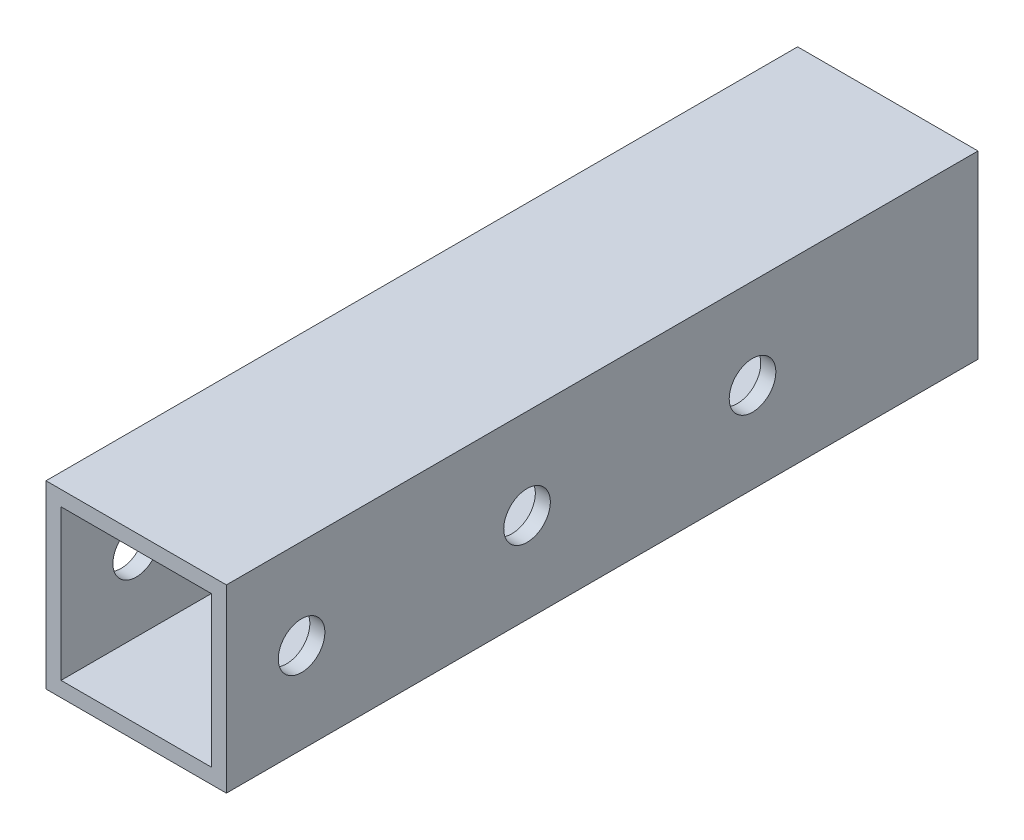
ISO-10303-21;
HEADER;
FILE_DESCRIPTION(('STEP AP214'),'2;1');
FILE_NAME('part.step','',(''),(''),'','','');
FILE_SCHEMA(('AUTOMOTIVE_DESIGN { 1 0 10303 214 1 1 1 1 }'));
ENDSEC;
DATA;
#1=APPLICATION_CONTEXT('core data for automotive mechanical design processes');
#2=APPLICATION_PROTOCOL_DEFINITION('international standard','automotive_design',2000,#1);
#3=PRODUCT_CONTEXT('',#1,'mechanical');
#4=PRODUCT('Part','Part','',(#3));
#5=PRODUCT_RELATED_PRODUCT_CATEGORY('part','',(#4));
#6=PRODUCT_DEFINITION_FORMATION('','',#4);
#7=PRODUCT_DEFINITION_CONTEXT('part definition',#1,'design');
#8=PRODUCT_DEFINITION('design','',#6,#7);
#9=PRODUCT_DEFINITION_SHAPE('','',#8);
#10=(LENGTH_UNIT() NAMED_UNIT(*) SI_UNIT(.MILLI.,.METRE.));
#11=(NAMED_UNIT(*) PLANE_ANGLE_UNIT() SI_UNIT($,.RADIAN.));
#12=(NAMED_UNIT(*) SI_UNIT($,.STERADIAN.) SOLID_ANGLE_UNIT());
#13=UNCERTAINTY_MEASURE_WITH_UNIT(LENGTH_MEASURE(1.E-05),#10,'distance_accuracy_value','');
#14=(GEOMETRIC_REPRESENTATION_CONTEXT(3) GLOBAL_UNCERTAINTY_ASSIGNED_CONTEXT((#13)) GLOBAL_UNIT_ASSIGNED_CONTEXT((#10,
#11,#12)) REPRESENTATION_CONTEXT('',''));
#15=CARTESIAN_POINT('',(0.,0.,0.));
#16=DIRECTION('',(0.,0.,1.));
#17=DIRECTION('',(1.,0.,0.));
#18=AXIS2_PLACEMENT_3D('',#15,#16,#17);
#19=CARTESIAN_POINT('',(0.,0.,50.));
#20=DIRECTION('',(0.,0.,-1.));
#21=DIRECTION('',(-1.,0.,0.));
#22=AXIS2_PLACEMENT_3D('',#19,#20,#21);
#23=PLANE('',#22);
#24=DIRECTION('',(0.,-1.,0.));
#25=VECTOR('',#24,1.);
#26=CARTESIAN_POINT('',(0.,0.,50.));
#27=LINE('',#26,#25);
#28=CARTESIAN_POINT('',(0.,12.,50.));
#29=VERTEX_POINT('',#28);
#30=CARTESIAN_POINT('',(0.,0.,50.));
#31=VERTEX_POINT('',#30);
#32=EDGE_CURVE('E146',#29,#31,#27,.T.);
#33=ORIENTED_EDGE('',*,*,#32,.T.);
#34=DIRECTION('',(1.,0.,0.));
#35=VECTOR('',#34,1.);
#36=CARTESIAN_POINT('',(0.,0.,50.));
#37=LINE('',#36,#35);
#38=CARTESIAN_POINT('',(12.,0.,50.));
#39=VERTEX_POINT('',#38);
#40=EDGE_CURVE('E149',#31,#39,#37,.T.);
#41=ORIENTED_EDGE('',*,*,#40,.T.);
#42=DIRECTION('',(0.,1.,0.));
#43=VECTOR('',#42,1.);
#44=CARTESIAN_POINT('',(12.,0.,50.));
#45=LINE('',#44,#43);
#46=CARTESIAN_POINT('',(12.,12.,50.));
#47=VERTEX_POINT('',#46);
#48=EDGE_CURVE('E152',#39,#47,#45,.T.);
#49=ORIENTED_EDGE('',*,*,#48,.T.);
#50=DIRECTION('',(-1.,0.,0.));
#51=VECTOR('',#50,1.);
#52=CARTESIAN_POINT('',(0.,12.,50.));
#53=LINE('',#52,#51);
#54=EDGE_CURVE('E154',#47,#29,#53,.T.);
#55=ORIENTED_EDGE('',*,*,#54,.T.);
#56=EDGE_LOOP('',(#33,#41,#49,#55));
#57=FACE_BOUND('',#56,.T.);
#58=DIRECTION('',(1.,0.,0.));
#59=VECTOR('',#58,1.);
#60=CARTESIAN_POINT('',(1.,1.,50.));
#61=LINE('',#60,#59);
#62=CARTESIAN_POINT('',(1.,1.,50.));
#63=VERTEX_POINT('',#62);
#64=CARTESIAN_POINT('',(11.,1.,50.));
#65=VERTEX_POINT('',#64);
#66=EDGE_CURVE('E108',#63,#65,#61,.T.);
#67=ORIENTED_EDGE('',*,*,#66,.F.);
#68=DIRECTION('',(0.,-1.,0.));
#69=VECTOR('',#68,1.);
#70=CARTESIAN_POINT('',(1.,1.,50.));
#71=LINE('',#70,#69);
#72=CARTESIAN_POINT('',(1.,11.,50.));
#73=VERTEX_POINT('',#72);
#74=EDGE_CURVE('E130',#73,#63,#71,.T.);
#75=ORIENTED_EDGE('',*,*,#74,.F.);
#76=DIRECTION('',(-1.,0.,0.));
#77=VECTOR('',#76,1.);
#78=CARTESIAN_POINT('',(1.,11.,50.));
#79=LINE('',#78,#77);
#80=CARTESIAN_POINT('',(11.,11.,50.));
#81=VERTEX_POINT('',#80);
#82=EDGE_CURVE('E128',#81,#73,#79,.T.);
#83=ORIENTED_EDGE('',*,*,#82,.F.);
#84=DIRECTION('',(0.,1.,0.));
#85=VECTOR('',#84,1.);
#86=CARTESIAN_POINT('',(11.,1.,50.));
#87=LINE('',#86,#85);
#88=EDGE_CURVE('E116',#65,#81,#87,.T.);
#89=ORIENTED_EDGE('',*,*,#88,.F.);
#90=EDGE_LOOP('',(#67,#75,#83,#89));
#91=FACE_BOUND('',#90,.T.);
#92=ADVANCED_FACE('F41',(#57,#91),#23,.F.);
#93=CARTESIAN_POINT('',(0.,0.,0.));
#94=DIRECTION('',(0.,0.,-1.));
#95=DIRECTION('',(-1.,0.,0.));
#96=AXIS2_PLACEMENT_3D('',#93,#94,#95);
#97=PLANE('',#96);
#98=DIRECTION('',(0.,-1.,0.));
#99=VECTOR('',#98,1.);
#100=CARTESIAN_POINT('',(0.,0.,0.));
#101=LINE('',#100,#99);
#102=CARTESIAN_POINT('',(0.,12.,0.));
#103=VERTEX_POINT('',#102);
#104=CARTESIAN_POINT('',(0.,0.,0.));
#105=VERTEX_POINT('',#104);
#106=EDGE_CURVE('E124',#103,#105,#101,.T.);
#107=ORIENTED_EDGE('',*,*,#106,.F.);
#108=DIRECTION('',(-1.,0.,0.));
#109=VECTOR('',#108,1.);
#110=CARTESIAN_POINT('',(0.,12.,0.));
#111=LINE('',#110,#109);
#112=CARTESIAN_POINT('',(12.,12.,0.));
#113=VERTEX_POINT('',#112);
#114=EDGE_CURVE('E150',#113,#103,#111,.T.);
#115=ORIENTED_EDGE('',*,*,#114,.F.);
#116=DIRECTION('',(0.,1.,0.));
#117=VECTOR('',#116,1.);
#118=CARTESIAN_POINT('',(12.,0.,0.));
#119=LINE('',#118,#117);
#120=CARTESIAN_POINT('',(12.,0.,0.));
#121=VERTEX_POINT('',#120);
#122=EDGE_CURVE('E161',#121,#113,#119,.T.);
#123=ORIENTED_EDGE('',*,*,#122,.F.);
#124=DIRECTION('',(1.,0.,0.));
#125=VECTOR('',#124,1.);
#126=CARTESIAN_POINT('',(0.,0.,0.));
#127=LINE('',#126,#125);
#128=EDGE_CURVE('E159',#105,#121,#127,.T.);
#129=ORIENTED_EDGE('',*,*,#128,.F.);
#130=EDGE_LOOP('',(#107,#115,#123,#129));
#131=FACE_BOUND('',#130,.T.);
#132=DIRECTION('',(0.,-1.,0.));
#133=VECTOR('',#132,1.);
#134=CARTESIAN_POINT('',(1.,1.,0.));
#135=LINE('',#134,#133);
#136=CARTESIAN_POINT('',(1.,11.,0.));
#137=VERTEX_POINT('',#136);
#138=CARTESIAN_POINT('',(1.,1.,0.));
#139=VERTEX_POINT('',#138);
#140=EDGE_CURVE('E117',#137,#139,#135,.T.);
#141=ORIENTED_EDGE('',*,*,#140,.T.);
#142=DIRECTION('',(1.,0.,0.));
#143=VECTOR('',#142,1.);
#144=CARTESIAN_POINT('',(1.,1.,0.));
#145=LINE('',#144,#143);
#146=CARTESIAN_POINT('',(11.,1.,0.));
#147=VERTEX_POINT('',#146);
#148=EDGE_CURVE('E66',#139,#147,#145,.T.);
#149=ORIENTED_EDGE('',*,*,#148,.T.);
#150=DIRECTION('',(0.,1.,0.));
#151=VECTOR('',#150,1.);
#152=CARTESIAN_POINT('',(11.,1.,0.));
#153=LINE('',#152,#151);
#154=CARTESIAN_POINT('',(11.,11.,0.));
#155=VERTEX_POINT('',#154);
#156=EDGE_CURVE('E123',#147,#155,#153,.T.);
#157=ORIENTED_EDGE('',*,*,#156,.T.);
#158=DIRECTION('',(-1.,0.,0.));
#159=VECTOR('',#158,1.);
#160=CARTESIAN_POINT('',(1.,11.,0.));
#161=LINE('',#160,#159);
#162=EDGE_CURVE('E138',#155,#137,#161,.T.);
#163=ORIENTED_EDGE('',*,*,#162,.T.);
#164=EDGE_LOOP('',(#141,#149,#157,#163));
#165=FACE_BOUND('',#164,.T.);
#166=ADVANCED_FACE('F208',(#131,#165),#97,.T.);
#167=CARTESIAN_POINT('',(0.,0.,50.));
#168=DIRECTION('',(1.,0.,0.));
#169=DIRECTION('',(0.,0.,-1.));
#170=AXIS2_PLACEMENT_3D('',#167,#168,#169);
#171=PLANE('',#170);
#172=CARTESIAN_POINT('',(0.,6.,15.));
#173=DIRECTION('',(-1.,0.,0.));
#174=DIRECTION('',(0.,0.,1.));
#175=AXIS2_PLACEMENT_3D('',#172,#173,#174);
#176=CIRCLE('',#175,1.55);
#177=CARTESIAN_POINT('',(0.,6.,16.55));
#178=VERTEX_POINT('',#177);
#179=EDGE_CURVE('E259',#178,#178,#176,.T.);
#180=ORIENTED_EDGE('',*,*,#179,.F.);
#181=EDGE_LOOP('',(#180));
#182=FACE_BOUND('',#181,.T.);
#183=CARTESIAN_POINT('',(0.,6.,30.));
#184=DIRECTION('',(-1.,0.,0.));
#185=DIRECTION('',(0.,0.,1.));
#186=AXIS2_PLACEMENT_3D('',#183,#184,#185);
#187=CIRCLE('',#186,1.55);
#188=CARTESIAN_POINT('',(0.,6.,31.55));
#189=VERTEX_POINT('',#188);
#190=EDGE_CURVE('E263',#189,#189,#187,.T.);
#191=ORIENTED_EDGE('',*,*,#190,.F.);
#192=EDGE_LOOP('',(#191));
#193=FACE_BOUND('',#192,.T.);
#194=CARTESIAN_POINT('',(0.,6.,45.));
#195=DIRECTION('',(-1.,0.,0.));
#196=DIRECTION('',(0.,0.,1.));
#197=AXIS2_PLACEMENT_3D('',#194,#195,#196);
#198=CIRCLE('',#197,1.55);
#199=CARTESIAN_POINT('',(0.,6.,46.55));
#200=VERTEX_POINT('',#199);
#201=EDGE_CURVE('E266',#200,#200,#198,.T.);
#202=ORIENTED_EDGE('',*,*,#201,.F.);
#203=EDGE_LOOP('',(#202));
#204=FACE_BOUND('',#203,.T.);
#205=ORIENTED_EDGE('',*,*,#106,.T.);
#206=DIRECTION('',(0.,0.,-1.));
#207=VECTOR('',#206,1.);
#208=CARTESIAN_POINT('',(0.,0.,50.));
#209=LINE('',#208,#207);
#210=EDGE_CURVE('E11',#31,#105,#209,.T.);
#211=ORIENTED_EDGE('',*,*,#210,.F.);
#212=ORIENTED_EDGE('',*,*,#32,.F.);
#213=DIRECTION('',(0.,0.,-1.));
#214=VECTOR('',#213,1.);
#215=CARTESIAN_POINT('',(0.,12.,50.));
#216=LINE('',#215,#214);
#217=EDGE_CURVE('E156',#29,#103,#216,.T.);
#218=ORIENTED_EDGE('',*,*,#217,.T.);
#219=EDGE_LOOP('',(#205,#211,#212,#218));
#220=FACE_BOUND('',#219,.T.);
#221=ADVANCED_FACE('F43',(#182,#193,#204,#220),#171,.F.);
#222=CARTESIAN_POINT('',(0.,0.,50.));
#223=DIRECTION('',(0.,1.,0.));
#224=DIRECTION('',(0.,0.,1.));
#225=AXIS2_PLACEMENT_3D('',#222,#223,#224);
#226=PLANE('',#225);
#227=ORIENTED_EDGE('',*,*,#128,.T.);
#228=DIRECTION('',(0.,0.,-1.));
#229=VECTOR('',#228,1.);
#230=CARTESIAN_POINT('',(12.,0.,50.));
#231=LINE('',#230,#229);
#232=EDGE_CURVE('E50',#39,#121,#231,.T.);
#233=ORIENTED_EDGE('',*,*,#232,.F.);
#234=ORIENTED_EDGE('',*,*,#40,.F.);
#235=ORIENTED_EDGE('',*,*,#210,.T.);
#236=EDGE_LOOP('',(#227,#233,#234,#235));
#237=FACE_BOUND('',#236,.T.);
#238=ADVANCED_FACE('F235',(#237),#226,.F.);
#239=CARTESIAN_POINT('',(12.,0.,50.));
#240=DIRECTION('',(-1.,0.,0.));
#241=DIRECTION('',(0.,0.,1.));
#242=AXIS2_PLACEMENT_3D('',#239,#240,#241);
#243=PLANE('',#242);
#244=CARTESIAN_POINT('',(12.,6.,15.));
#245=DIRECTION('',(-1.,0.,0.));
#246=DIRECTION('',(0.,0.,1.));
#247=AXIS2_PLACEMENT_3D('',#244,#245,#246);
#248=CIRCLE('',#247,1.55);
#249=CARTESIAN_POINT('',(12.,6.,16.55));
#250=VERTEX_POINT('',#249);
#251=EDGE_CURVE('E174',#250,#250,#248,.T.);
#252=ORIENTED_EDGE('',*,*,#251,.T.);
#253=EDGE_LOOP('',(#252));
#254=FACE_BOUND('',#253,.T.);
#255=CARTESIAN_POINT('',(12.,6.,30.));
#256=DIRECTION('',(-1.,0.,0.));
#257=DIRECTION('',(0.,0.,1.));
#258=AXIS2_PLACEMENT_3D('',#255,#256,#257);
#259=CIRCLE('',#258,1.55);
#260=CARTESIAN_POINT('',(12.,6.,31.55));
#261=VERTEX_POINT('',#260);
#262=EDGE_CURVE('E268',#261,#261,#259,.T.);
#263=ORIENTED_EDGE('',*,*,#262,.T.);
#264=EDGE_LOOP('',(#263));
#265=FACE_BOUND('',#264,.T.);
#266=CARTESIAN_POINT('',(12.,6.,45.));
#267=DIRECTION('',(-1.,0.,0.));
#268=DIRECTION('',(0.,0.,1.));
#269=AXIS2_PLACEMENT_3D('',#266,#267,#268);
#270=CIRCLE('',#269,1.55);
#271=CARTESIAN_POINT('',(12.,6.,46.55));
#272=VERTEX_POINT('',#271);
#273=EDGE_CURVE('E187',#272,#272,#270,.T.);
#274=ORIENTED_EDGE('',*,*,#273,.T.);
#275=EDGE_LOOP('',(#274));
#276=FACE_BOUND('',#275,.T.);
#277=ORIENTED_EDGE('',*,*,#122,.T.);
#278=DIRECTION('',(0.,0.,-1.));
#279=VECTOR('',#278,1.);
#280=CARTESIAN_POINT('',(12.,12.,50.));
#281=LINE('',#280,#279);
#282=EDGE_CURVE('E166',#47,#113,#281,.T.);
#283=ORIENTED_EDGE('',*,*,#282,.F.);
#284=ORIENTED_EDGE('',*,*,#48,.F.);
#285=ORIENTED_EDGE('',*,*,#232,.T.);
#286=EDGE_LOOP('',(#277,#283,#284,#285));
#287=FACE_BOUND('',#286,.T.);
#288=ADVANCED_FACE('F232',(#254,#265,#276,#287),#243,.F.);
#289=CARTESIAN_POINT('',(0.,12.,50.));
#290=DIRECTION('',(0.,-1.,0.));
#291=DIRECTION('',(0.,0.,-1.));
#292=AXIS2_PLACEMENT_3D('',#289,#290,#291);
#293=PLANE('',#292);
#294=ORIENTED_EDGE('',*,*,#114,.T.);
#295=ORIENTED_EDGE('',*,*,#217,.F.);
#296=ORIENTED_EDGE('',*,*,#54,.F.);
#297=ORIENTED_EDGE('',*,*,#282,.T.);
#298=EDGE_LOOP('',(#294,#295,#296,#297));
#299=FACE_BOUND('',#298,.T.);
#300=ADVANCED_FACE('F229',(#299),#293,.F.);
#301=CARTESIAN_POINT('',(1.,1.,50.));
#302=DIRECTION('',(0.,1.,0.));
#303=DIRECTION('',(0.,0.,1.));
#304=AXIS2_PLACEMENT_3D('',#301,#302,#303);
#305=PLANE('',#304);
#306=ORIENTED_EDGE('',*,*,#148,.F.);
#307=DIRECTION('',(0.,0.,-1.));
#308=VECTOR('',#307,1.);
#309=CARTESIAN_POINT('',(1.,1.,50.));
#310=LINE('',#309,#308);
#311=EDGE_CURVE('E112',#63,#139,#310,.T.);
#312=ORIENTED_EDGE('',*,*,#311,.F.);
#313=ORIENTED_EDGE('',*,*,#66,.T.);
#314=DIRECTION('',(0.,0.,-1.));
#315=VECTOR('',#314,1.);
#316=CARTESIAN_POINT('',(11.,1.,50.));
#317=LINE('',#316,#315);
#318=EDGE_CURVE('E111',#65,#147,#317,.T.);
#319=ORIENTED_EDGE('',*,*,#318,.T.);
#320=EDGE_LOOP('',(#306,#312,#313,#319));
#321=FACE_BOUND('',#320,.T.);
#322=ADVANCED_FACE('F110',(#321),#305,.T.);
#323=CARTESIAN_POINT('',(11.,1.,50.));
#324=DIRECTION('',(-1.,0.,0.));
#325=DIRECTION('',(0.,0.,1.));
#326=AXIS2_PLACEMENT_3D('',#323,#324,#325);
#327=PLANE('',#326);
#328=CARTESIAN_POINT('',(11.,6.,15.));
#329=DIRECTION('',(-1.,0.,0.));
#330=DIRECTION('',(0.,0.,1.));
#331=AXIS2_PLACEMENT_3D('',#328,#329,#330);
#332=CIRCLE('',#331,1.55);
#333=CARTESIAN_POINT('',(11.,6.,16.55));
#334=VERTEX_POINT('',#333);
#335=EDGE_CURVE('E136',#334,#334,#332,.T.);
#336=ORIENTED_EDGE('',*,*,#335,.F.);
#337=EDGE_LOOP('',(#336));
#338=FACE_BOUND('',#337,.T.);
#339=CARTESIAN_POINT('',(11.,6.,30.));
#340=DIRECTION('',(-1.,0.,0.));
#341=DIRECTION('',(0.,0.,1.));
#342=AXIS2_PLACEMENT_3D('',#339,#340,#341);
#343=CIRCLE('',#342,1.55);
#344=CARTESIAN_POINT('',(11.,6.,31.55));
#345=VERTEX_POINT('',#344);
#346=EDGE_CURVE('E177',#345,#345,#343,.T.);
#347=ORIENTED_EDGE('',*,*,#346,.F.);
#348=EDGE_LOOP('',(#347));
#349=FACE_BOUND('',#348,.T.);
#350=CARTESIAN_POINT('',(11.,6.,45.));
#351=DIRECTION('',(-1.,0.,0.));
#352=DIRECTION('',(0.,0.,1.));
#353=AXIS2_PLACEMENT_3D('',#350,#351,#352);
#354=CIRCLE('',#353,1.55);
#355=CARTESIAN_POINT('',(11.,6.,46.55));
#356=VERTEX_POINT('',#355);
#357=EDGE_CURVE('E173',#356,#356,#354,.T.);
#358=ORIENTED_EDGE('',*,*,#357,.F.);
#359=EDGE_LOOP('',(#358));
#360=FACE_BOUND('',#359,.T.);
#361=ORIENTED_EDGE('',*,*,#156,.F.);
#362=ORIENTED_EDGE('',*,*,#318,.F.);
#363=ORIENTED_EDGE('',*,*,#88,.T.);
#364=DIRECTION('',(0.,0.,-1.));
#365=VECTOR('',#364,1.);
#366=CARTESIAN_POINT('',(11.,11.,50.));
#367=LINE('',#366,#365);
#368=EDGE_CURVE('E125',#81,#155,#367,.T.);
#369=ORIENTED_EDGE('',*,*,#368,.T.);
#370=EDGE_LOOP('',(#361,#362,#363,#369));
#371=FACE_BOUND('',#370,.T.);
#372=ADVANCED_FACE('F120',(#338,#349,#360,#371),#327,.T.);
#373=CARTESIAN_POINT('',(1.,11.,50.));
#374=DIRECTION('',(0.,-1.,0.));
#375=DIRECTION('',(0.,0.,-1.));
#376=AXIS2_PLACEMENT_3D('',#373,#374,#375);
#377=PLANE('',#376);
#378=ORIENTED_EDGE('',*,*,#162,.F.);
#379=ORIENTED_EDGE('',*,*,#368,.F.);
#380=ORIENTED_EDGE('',*,*,#82,.T.);
#381=DIRECTION('',(0.,0.,-1.));
#382=VECTOR('',#381,1.);
#383=CARTESIAN_POINT('',(1.,11.,50.));
#384=LINE('',#383,#382);
#385=EDGE_CURVE('E58',#73,#137,#384,.T.);
#386=ORIENTED_EDGE('',*,*,#385,.T.);
#387=EDGE_LOOP('',(#378,#379,#380,#386));
#388=FACE_BOUND('',#387,.T.);
#389=ADVANCED_FACE('F202',(#388),#377,.T.);
#390=CARTESIAN_POINT('',(1.,1.,50.));
#391=DIRECTION('',(1.,0.,0.));
#392=DIRECTION('',(0.,0.,-1.));
#393=AXIS2_PLACEMENT_3D('',#390,#391,#392);
#394=PLANE('',#393);
#395=CARTESIAN_POINT('',(1.,6.,15.));
#396=DIRECTION('',(1.,0.,0.));
#397=DIRECTION('',(0.,0.,-1.));
#398=AXIS2_PLACEMENT_3D('',#395,#396,#397);
#399=CIRCLE('',#398,1.55);
#400=CARTESIAN_POINT('',(1.,6.,13.45));
#401=VERTEX_POINT('',#400);
#402=EDGE_CURVE('E45',#401,#401,#399,.T.);
#403=ORIENTED_EDGE('',*,*,#402,.F.);
#404=EDGE_LOOP('',(#403));
#405=FACE_BOUND('',#404,.T.);
#406=CARTESIAN_POINT('',(1.,6.,30.));
#407=DIRECTION('',(1.,0.,0.));
#408=DIRECTION('',(0.,0.,-1.));
#409=AXIS2_PLACEMENT_3D('',#406,#407,#408);
#410=CIRCLE('',#409,1.55);
#411=CARTESIAN_POINT('',(1.,6.,28.45));
#412=VERTEX_POINT('',#411);
#413=EDGE_CURVE('E175',#412,#412,#410,.T.);
#414=ORIENTED_EDGE('',*,*,#413,.F.);
#415=EDGE_LOOP('',(#414));
#416=FACE_BOUND('',#415,.T.);
#417=CARTESIAN_POINT('',(1.,6.,45.));
#418=DIRECTION('',(1.,0.,0.));
#419=DIRECTION('',(0.,0.,-1.));
#420=AXIS2_PLACEMENT_3D('',#417,#418,#419);
#421=CIRCLE('',#420,1.55);
#422=CARTESIAN_POINT('',(1.,6.,43.45));
#423=VERTEX_POINT('',#422);
#424=EDGE_CURVE('E171',#423,#423,#421,.T.);
#425=ORIENTED_EDGE('',*,*,#424,.F.);
#426=EDGE_LOOP('',(#425));
#427=FACE_BOUND('',#426,.T.);
#428=ORIENTED_EDGE('',*,*,#140,.F.);
#429=ORIENTED_EDGE('',*,*,#385,.F.);
#430=ORIENTED_EDGE('',*,*,#74,.T.);
#431=ORIENTED_EDGE('',*,*,#311,.T.);
#432=EDGE_LOOP('',(#428,#429,#430,#431));
#433=FACE_BOUND('',#432,.T.);
#434=ADVANCED_FACE('F198',(#405,#416,#427,#433),#394,.T.);
#435=CARTESIAN_POINT('',(12.,6.,45.));
#436=DIRECTION('',(-1.,0.,0.));
#437=DIRECTION('',(0.,0.,1.));
#438=AXIS2_PLACEMENT_3D('',#435,#436,#437);
#439=CYLINDRICAL_SURFACE('',#438,1.55);
#440=ORIENTED_EDGE('',*,*,#424,.T.);
#441=EDGE_LOOP('',(#440));
#442=FACE_BOUND('',#441,.T.);
#443=ORIENTED_EDGE('',*,*,#201,.T.);
#444=EDGE_LOOP('',(#443));
#445=FACE_BOUND('',#444,.T.);
#446=ADVANCED_FACE('F201',(#442,#445),#439,.F.);
#447=CARTESIAN_POINT('',(12.,6.,30.));
#448=DIRECTION('',(-1.,0.,0.));
#449=DIRECTION('',(0.,0.,1.));
#450=AXIS2_PLACEMENT_3D('',#447,#448,#449);
#451=CYLINDRICAL_SURFACE('',#450,1.55);
#452=ORIENTED_EDGE('',*,*,#413,.T.);
#453=EDGE_LOOP('',(#452));
#454=FACE_BOUND('',#453,.T.);
#455=ORIENTED_EDGE('',*,*,#190,.T.);
#456=EDGE_LOOP('',(#455));
#457=FACE_BOUND('',#456,.T.);
#458=ADVANCED_FACE('F289',(#454,#457),#451,.F.);
#459=CARTESIAN_POINT('',(12.,6.,15.));
#460=DIRECTION('',(-1.,0.,0.));
#461=DIRECTION('',(0.,0.,1.));
#462=AXIS2_PLACEMENT_3D('',#459,#460,#461);
#463=CYLINDRICAL_SURFACE('',#462,1.55);
#464=ORIENTED_EDGE('',*,*,#402,.T.);
#465=EDGE_LOOP('',(#464));
#466=FACE_BOUND('',#465,.T.);
#467=ORIENTED_EDGE('',*,*,#179,.T.);
#468=EDGE_LOOP('',(#467));
#469=FACE_BOUND('',#468,.T.);
#470=ADVANCED_FACE('F195',(#466,#469),#463,.F.);
#471=ORIENTED_EDGE('',*,*,#357,.T.);
#472=EDGE_LOOP('',(#471));
#473=FACE_BOUND('',#472,.T.);
#474=ORIENTED_EDGE('',*,*,#273,.F.);
#475=EDGE_LOOP('',(#474));
#476=FACE_BOUND('',#475,.T.);
#477=ADVANCED_FACE('F286',(#473,#476),#439,.F.);
#478=ORIENTED_EDGE('',*,*,#346,.T.);
#479=EDGE_LOOP('',(#478));
#480=FACE_BOUND('',#479,.T.);
#481=ORIENTED_EDGE('',*,*,#262,.F.);
#482=EDGE_LOOP('',(#481));
#483=FACE_BOUND('',#482,.T.);
#484=ADVANCED_FACE('F281',(#480,#483),#451,.F.);
#485=ORIENTED_EDGE('',*,*,#335,.T.);
#486=EDGE_LOOP('',(#485));
#487=FACE_BOUND('',#486,.T.);
#488=ORIENTED_EDGE('',*,*,#251,.F.);
#489=EDGE_LOOP('',(#488));
#490=FACE_BOUND('',#489,.T.);
#491=ADVANCED_FACE('F279',(#487,#490),#463,.F.);
#492=CLOSED_SHELL('',(#92,#166,#221,#238,#288,#300,#322,#372,#389,#434,#446,#458,#470,#477,#484,#491));
#493=MANIFOLD_SOLID_BREP('B2',#492);
#494=ADVANCED_BREP_SHAPE_REPRESENTATION('',(#18,#493),#14);
#495=SHAPE_DEFINITION_REPRESENTATION(#9,#494);
ENDSEC;
END-ISO-10303-21;
